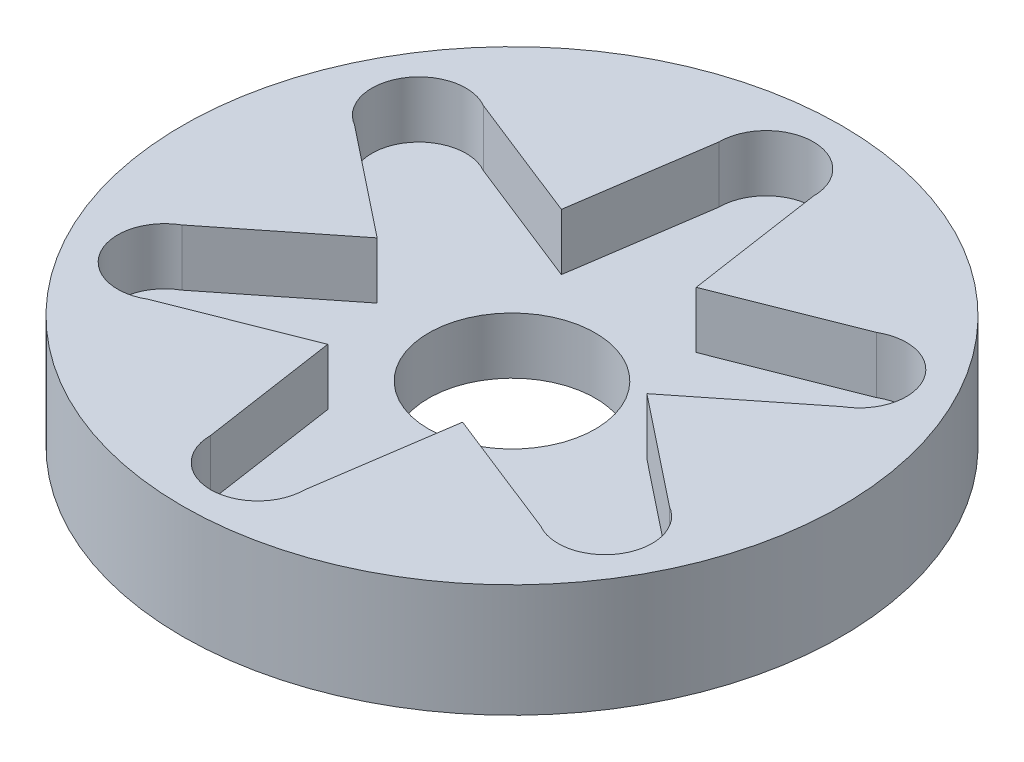
ISO-10303-21;
HEADER;
FILE_DESCRIPTION(('STEP AP214'),'2;1');
FILE_NAME('part.step','',(''),(''),'','','');
FILE_SCHEMA(('AUTOMOTIVE_DESIGN { 1 0 10303 214 1 1 1 1 }'));
ENDSEC;
DATA;
#1=APPLICATION_CONTEXT('core data for automotive mechanical design processes');
#2=APPLICATION_PROTOCOL_DEFINITION('international standard','automotive_design',2000,#1);
#3=PRODUCT_CONTEXT('',#1,'mechanical');
#4=PRODUCT('Part','Part','',(#3));
#5=PRODUCT_RELATED_PRODUCT_CATEGORY('part','',(#4));
#6=PRODUCT_DEFINITION_FORMATION('','',#4);
#7=PRODUCT_DEFINITION_CONTEXT('part definition',#1,'design');
#8=PRODUCT_DEFINITION('design','',#6,#7);
#9=PRODUCT_DEFINITION_SHAPE('','',#8);
#10=(LENGTH_UNIT() NAMED_UNIT(*) SI_UNIT(.MILLI.,.METRE.));
#11=(NAMED_UNIT(*) PLANE_ANGLE_UNIT() SI_UNIT($,.RADIAN.));
#12=(NAMED_UNIT(*) SI_UNIT($,.STERADIAN.) SOLID_ANGLE_UNIT());
#13=UNCERTAINTY_MEASURE_WITH_UNIT(LENGTH_MEASURE(1.E-05),#10,'distance_accuracy_value','');
#14=(GEOMETRIC_REPRESENTATION_CONTEXT(3) GLOBAL_UNCERTAINTY_ASSIGNED_CONTEXT((#13)) GLOBAL_UNIT_ASSIGNED_CONTEXT((#10,
#11,#12)) REPRESENTATION_CONTEXT('',''));
#15=CARTESIAN_POINT('',(0.,0.,0.));
#16=DIRECTION('',(0.,0.,1.));
#17=DIRECTION('',(1.,0.,0.));
#18=AXIS2_PLACEMENT_3D('',#15,#16,#17);
#19=CARTESIAN_POINT('',(-11.6913429510899,6.,-6.74999999999999));
#20=DIRECTION('',(0.,-1.,0.));
#21=DIRECTION('',(0.,0.,-1.));
#22=AXIS2_PLACEMENT_3D('',#19,#20,#21);
#23=CYLINDRICAL_SURFACE('',#22,2.5);
#24=CARTESIAN_POINT('',(-11.6913429510899,3.,-6.74999999999999));
#25=DIRECTION('',(0.,1.,0.));
#26=DIRECTION('',(0.,0.,1.));
#27=AXIS2_PLACEMENT_3D('',#24,#25,#26);
#28=CIRCLE('',#27,2.5);
#29=CARTESIAN_POINT('',(-10.4413429510899,3.,-8.91506350946109));
#30=VERTEX_POINT('',#29);
#31=CARTESIAN_POINT('',(-12.9413429510899,3.,-4.58493649053889));
#32=VERTEX_POINT('',#31);
#33=EDGE_CURVE('E108',#30,#32,#28,.T.);
#34=ORIENTED_EDGE('',*,*,#33,.F.);
#35=DIRECTION('',(0.,-1.,0.));
#36=VECTOR('',#35,1.);
#37=CARTESIAN_POINT('',(-10.4413429510899,6.,-8.91506350946109));
#38=LINE('',#37,#36);
#39=CARTESIAN_POINT('',(-10.4413429510899,6.,-8.91506350946109));
#40=VERTEX_POINT('',#39);
#41=EDGE_CURVE('E12',#40,#30,#38,.T.);
#42=ORIENTED_EDGE('',*,*,#41,.F.);
#43=CARTESIAN_POINT('',(-11.6913429510899,6.,-6.74999999999999));
#44=DIRECTION('',(0.,1.,0.));
#45=DIRECTION('',(0.,0.,1.));
#46=AXIS2_PLACEMENT_3D('',#43,#44,#45);
#47=CIRCLE('',#46,2.5);
#48=CARTESIAN_POINT('',(-12.9413429510899,6.,-4.58493649053889));
#49=VERTEX_POINT('',#48);
#50=EDGE_CURVE('E266',#40,#49,#47,.T.);
#51=ORIENTED_EDGE('',*,*,#50,.T.);
#52=DIRECTION('',(0.,-1.,0.));
#53=VECTOR('',#52,1.);
#54=CARTESIAN_POINT('',(-12.9413429510899,6.,-4.58493649053889));
#55=LINE('',#54,#53);
#56=EDGE_CURVE('E229',#49,#32,#55,.T.);
#57=ORIENTED_EDGE('',*,*,#56,.T.);
#58=EDGE_LOOP('',(#34,#42,#51,#57));
#59=FACE_BOUND('',#58,.T.);
#60=ADVANCED_FACE('F94',(#59),#23,.F.);
#61=CARTESIAN_POINT('',(1.63672705202787,6.,-4.13959239881188));
#62=DIRECTION('',(0.367686867782864,0.,-0.929949658454707));
#63=DIRECTION('',(-0.929949658454707,0.,-0.367686867782864));
#64=AXIS2_PLACEMENT_3D('',#61,#62,#63);
#65=PLANE('',#64);
#66=ORIENTED_EDGE('',*,*,#41,.T.);
#67=DIRECTION('',(0.929949658454707,0.,0.367686867782864));
#68=VECTOR('',#67,1.);
#69=CARTESIAN_POINT('',(1.63672705202787,3.,-4.13959239881188));
#70=LINE('',#69,#68);
#71=CARTESIAN_POINT('',(-3.58109149415789,3.,-6.20263241443421));
#72=VERTEX_POINT('',#71);
#73=EDGE_CURVE('E114',#30,#72,#70,.T.);
#74=ORIENTED_EDGE('',*,*,#73,.T.);
#75=DIRECTION('',(0.,-1.,0.));
#76=VECTOR('',#75,1.);
#77=CARTESIAN_POINT('',(-3.58109149415789,6.,-6.20263241443421));
#78=LINE('',#77,#76);
#79=CARTESIAN_POINT('',(-3.58109149415789,6.,-6.20263241443421));
#80=VERTEX_POINT('',#79);
#81=EDGE_CURVE('E101',#80,#72,#78,.T.);
#82=ORIENTED_EDGE('',*,*,#81,.F.);
#83=DIRECTION('',(0.929949658454707,0.,0.367686867782864));
#84=VECTOR('',#83,1.);
#85=CARTESIAN_POINT('',(1.63672705202787,6.,-4.13959239881188));
#86=LINE('',#85,#84);
#87=EDGE_CURVE('E269',#40,#80,#86,.T.);
#88=ORIENTED_EDGE('',*,*,#87,.F.);
#89=EDGE_LOOP('',(#66,#74,#82,#88));
#90=FACE_BOUND('',#89,.T.);
#91=ADVANCED_FACE('F429',(#90),#65,.F.);
#92=CARTESIAN_POINT('',(-4.40335570469799,6.,-0.65234899328859));
#93=DIRECTION('',(0.989203462353871,0.,0.146548661089462));
#94=DIRECTION('',(0.146548661089462,0.,-0.989203462353871));
#95=AXIS2_PLACEMENT_3D('',#92,#93,#94);
#96=PLANE('',#95);
#97=DIRECTION('',(-0.146548661089462,0.,0.989203462353871));
#98=VECTOR('',#97,1.);
#99=CARTESIAN_POINT('',(-4.40335570469799,3.,-0.65234899328859));
#100=LINE('',#99,#98);
#101=CARTESIAN_POINT('',(-2.5,3.,-13.5));
#102=VERTEX_POINT('',#101);
#103=EDGE_CURVE('E360',#102,#72,#100,.T.);
#104=ORIENTED_EDGE('',*,*,#103,.F.);
#105=DIRECTION('',(0.,-1.,0.));
#106=VECTOR('',#105,1.);
#107=CARTESIAN_POINT('',(-2.5,6.,-13.5));
#108=LINE('',#107,#106);
#109=CARTESIAN_POINT('',(-2.5,6.,-13.5));
#110=VERTEX_POINT('',#109);
#111=EDGE_CURVE('E355',#110,#102,#108,.T.);
#112=ORIENTED_EDGE('',*,*,#111,.F.);
#113=DIRECTION('',(-0.146548661089462,0.,0.989203462353871));
#114=VECTOR('',#113,1.);
#115=CARTESIAN_POINT('',(-4.40335570469799,6.,-0.65234899328859));
#116=LINE('',#115,#114);
#117=EDGE_CURVE('E271',#110,#80,#116,.T.);
#118=ORIENTED_EDGE('',*,*,#117,.T.);
#119=ORIENTED_EDGE('',*,*,#81,.T.);
#120=EDGE_LOOP('',(#104,#112,#118,#119));
#121=FACE_BOUND('',#120,.T.);
#122=ADVANCED_FACE('F359',(#121),#96,.T.);
#123=CARTESIAN_POINT('',(0.,6.,-13.5));
#124=DIRECTION('',(0.,-1.,0.));
#125=DIRECTION('',(0.,0.,-1.));
#126=AXIS2_PLACEMENT_3D('',#123,#124,#125);
#127=CYLINDRICAL_SURFACE('',#126,2.5);
#128=CARTESIAN_POINT('',(0.,3.,-13.5));
#129=DIRECTION('',(0.,1.,0.));
#130=DIRECTION('',(0.,0.,1.));
#131=AXIS2_PLACEMENT_3D('',#128,#129,#130);
#132=CIRCLE('',#131,2.5);
#133=CARTESIAN_POINT('',(2.5,3.,-13.5));
#134=VERTEX_POINT('',#133);
#135=EDGE_CURVE('E365',#134,#102,#132,.T.);
#136=ORIENTED_EDGE('',*,*,#135,.F.);
#137=DIRECTION('',(0.,-1.,0.));
#138=VECTOR('',#137,1.);
#139=CARTESIAN_POINT('',(2.5,6.,-13.5));
#140=LINE('',#139,#138);
#141=CARTESIAN_POINT('',(2.5,6.,-13.5));
#142=VERTEX_POINT('',#141);
#143=EDGE_CURVE('E352',#142,#134,#140,.T.);
#144=ORIENTED_EDGE('',*,*,#143,.F.);
#145=CARTESIAN_POINT('',(0.,6.,-13.5));
#146=DIRECTION('',(0.,1.,0.));
#147=DIRECTION('',(0.,0.,1.));
#148=AXIS2_PLACEMENT_3D('',#145,#146,#147);
#149=CIRCLE('',#148,2.5);
#150=EDGE_CURVE('E274',#142,#110,#149,.T.);
#151=ORIENTED_EDGE('',*,*,#150,.T.);
#152=ORIENTED_EDGE('',*,*,#111,.T.);
#153=EDGE_LOOP('',(#136,#144,#151,#152));
#154=FACE_BOUND('',#153,.T.);
#155=ADVANCED_FACE('F428',(#154),#127,.F.);
#156=CARTESIAN_POINT('',(4.40335570469799,6.,-0.65234899328859));
#157=DIRECTION('',(0.989203462353871,0.,-0.146548661089462));
#158=DIRECTION('',(-0.146548661089462,0.,-0.989203462353871));
#159=AXIS2_PLACEMENT_3D('',#156,#157,#158);
#160=PLANE('',#159);
#161=ORIENTED_EDGE('',*,*,#143,.T.);
#162=DIRECTION('',(0.146548661089462,0.,0.989203462353871));
#163=VECTOR('',#162,1.);
#164=CARTESIAN_POINT('',(4.40335570469799,3.,-0.65234899328859));
#165=LINE('',#164,#163);
#166=CARTESIAN_POINT('',(3.58109149415789,3.,-6.20263241443422));
#167=VERTEX_POINT('',#166);
#168=EDGE_CURVE('E367',#134,#167,#165,.T.);
#169=ORIENTED_EDGE('',*,*,#168,.T.);
#170=DIRECTION('',(0.,-1.,0.));
#171=VECTOR('',#170,1.);
#172=CARTESIAN_POINT('',(3.58109149415789,6.,-6.20263241443422));
#173=LINE('',#172,#171);
#174=CARTESIAN_POINT('',(3.58109149415789,6.,-6.20263241443422));
#175=VERTEX_POINT('',#174);
#176=EDGE_CURVE('E349',#175,#167,#173,.T.);
#177=ORIENTED_EDGE('',*,*,#176,.F.);
#178=DIRECTION('',(0.146548661089462,0.,0.989203462353871));
#179=VECTOR('',#178,1.);
#180=CARTESIAN_POINT('',(4.40335570469799,6.,-0.65234899328859));
#181=LINE('',#180,#179);
#182=EDGE_CURVE('E277',#142,#175,#181,.T.);
#183=ORIENTED_EDGE('',*,*,#182,.F.);
#184=EDGE_LOOP('',(#161,#169,#177,#183));
#185=FACE_BOUND('',#184,.T.);
#186=ADVANCED_FACE('F425',(#185),#160,.F.);
#187=CARTESIAN_POINT('',(-1.63672705202787,6.,-4.13959239881188));
#188=DIRECTION('',(0.367686867782865,0.,0.929949658454707));
#189=DIRECTION('',(0.929949658454707,0.,-0.367686867782865));
#190=AXIS2_PLACEMENT_3D('',#187,#188,#189);
#191=PLANE('',#190);
#192=DIRECTION('',(-0.929949658454707,0.,0.367686867782865));
#193=VECTOR('',#192,1.);
#194=CARTESIAN_POINT('',(-1.63672705202787,3.,-4.13959239881188));
#195=LINE('',#194,#193);
#196=CARTESIAN_POINT('',(10.4413429510899,3.,-8.9150635094611));
#197=VERTEX_POINT('',#196);
#198=EDGE_CURVE('E371',#197,#167,#195,.T.);
#199=ORIENTED_EDGE('',*,*,#198,.F.);
#200=DIRECTION('',(0.,-1.,0.));
#201=VECTOR('',#200,1.);
#202=CARTESIAN_POINT('',(10.4413429510899,6.,-8.9150635094611));
#203=LINE('',#202,#201);
#204=CARTESIAN_POINT('',(10.4413429510899,6.,-8.9150635094611));
#205=VERTEX_POINT('',#204);
#206=EDGE_CURVE('E346',#205,#197,#203,.T.);
#207=ORIENTED_EDGE('',*,*,#206,.F.);
#208=DIRECTION('',(-0.929949658454707,0.,0.367686867782865));
#209=VECTOR('',#208,1.);
#210=CARTESIAN_POINT('',(-1.63672705202787,6.,-4.13959239881188));
#211=LINE('',#210,#209);
#212=EDGE_CURVE('E279',#205,#175,#211,.T.);
#213=ORIENTED_EDGE('',*,*,#212,.T.);
#214=ORIENTED_EDGE('',*,*,#176,.T.);
#215=EDGE_LOOP('',(#199,#207,#213,#214));
#216=FACE_BOUND('',#215,.T.);
#217=ADVANCED_FACE('F420',(#216),#191,.T.);
#218=CARTESIAN_POINT('',(11.6913429510899,6.,-6.75));
#219=DIRECTION('',(0.,-1.,0.));
#220=DIRECTION('',(0.,0.,-1.));
#221=AXIS2_PLACEMENT_3D('',#218,#219,#220);
#222=CYLINDRICAL_SURFACE('',#221,2.5);
#223=CARTESIAN_POINT('',(11.6913429510899,3.,-6.75));
#224=DIRECTION('',(0.,1.,0.));
#225=DIRECTION('',(0.,0.,1.));
#226=AXIS2_PLACEMENT_3D('',#223,#224,#225);
#227=CIRCLE('',#226,2.5);
#228=CARTESIAN_POINT('',(12.9413429510899,3.,-4.58493649053891));
#229=VERTEX_POINT('',#228);
#230=EDGE_CURVE('E374',#229,#197,#227,.T.);
#231=ORIENTED_EDGE('',*,*,#230,.F.);
#232=DIRECTION('',(0.,-1.,0.));
#233=VECTOR('',#232,1.);
#234=CARTESIAN_POINT('',(12.9413429510899,6.,-4.58493649053891));
#235=LINE('',#234,#233);
#236=CARTESIAN_POINT('',(12.9413429510899,6.,-4.58493649053891));
#237=VERTEX_POINT('',#236);
#238=EDGE_CURVE('E343',#237,#229,#235,.T.);
#239=ORIENTED_EDGE('',*,*,#238,.F.);
#240=CARTESIAN_POINT('',(11.6913429510899,6.,-6.75));
#241=DIRECTION('',(0.,1.,0.));
#242=DIRECTION('',(0.,0.,1.));
#243=AXIS2_PLACEMENT_3D('',#240,#241,#242);
#244=CIRCLE('',#243,2.5);
#245=EDGE_CURVE('E282',#237,#205,#244,.T.);
#246=ORIENTED_EDGE('',*,*,#245,.T.);
#247=ORIENTED_EDGE('',*,*,#206,.T.);
#248=EDGE_LOOP('',(#231,#239,#246,#247));
#249=FACE_BOUND('',#248,.T.);
#250=ADVANCED_FACE('F418',(#249),#222,.F.);
#251=CARTESIAN_POINT('',(2.76662865267012,6.,3.48724340552329));
#252=DIRECTION('',(0.621516594571006,0.,0.783400997365245));
#253=DIRECTION('',(0.783400997365244,0.,-0.621516594571006));
#254=AXIS2_PLACEMENT_3D('',#251,#252,#253);
#255=PLANE('',#254);
#256=ORIENTED_EDGE('',*,*,#238,.T.);
#257=DIRECTION('',(-0.783400997365245,0.,0.621516594571006));
#258=VECTOR('',#257,1.);
#259=CARTESIAN_POINT('',(2.76662865267012,3.,3.48724340552329));
#260=LINE('',#259,#258);
#261=CARTESIAN_POINT('',(7.16218298831579,3.,0.));
#262=VERTEX_POINT('',#261);
#263=EDGE_CURVE('E377',#229,#262,#260,.T.);
#264=ORIENTED_EDGE('',*,*,#263,.T.);
#265=DIRECTION('',(0.,-1.,0.));
#266=VECTOR('',#265,1.);
#267=CARTESIAN_POINT('',(7.16218298831579,6.,0.));
#268=LINE('',#267,#266);
#269=CARTESIAN_POINT('',(7.16218298831579,6.,0.));
#270=VERTEX_POINT('',#269);
#271=EDGE_CURVE('E340',#270,#262,#268,.T.);
#272=ORIENTED_EDGE('',*,*,#271,.F.);
#273=DIRECTION('',(-0.783400997365245,0.,0.621516594571006));
#274=VECTOR('',#273,1.);
#275=CARTESIAN_POINT('',(2.76662865267012,6.,3.48724340552329));
#276=LINE('',#275,#274);
#277=EDGE_CURVE('E285',#237,#270,#276,.T.);
#278=ORIENTED_EDGE('',*,*,#277,.F.);
#279=EDGE_LOOP('',(#256,#264,#272,#278));
#280=FACE_BOUND('',#279,.T.);
#281=ADVANCED_FACE('F415',(#280),#255,.F.);
#282=CARTESIAN_POINT('',(2.76662865267012,6.,-3.48724340552329));
#283=DIRECTION('',(-0.621516594571006,0.,0.783400997365244));
#284=DIRECTION('',(0.783400997365245,0.,0.621516594571006));
#285=AXIS2_PLACEMENT_3D('',#282,#283,#284);
#286=PLANE('',#285);
#287=DIRECTION('',(-0.783400997365245,0.,-0.621516594571006));
#288=VECTOR('',#287,1.);
#289=CARTESIAN_POINT('',(2.76662865267012,3.,-3.48724340552329));
#290=LINE('',#289,#288);
#291=CARTESIAN_POINT('',(12.9413429510899,3.,4.5849364905389));
#292=VERTEX_POINT('',#291);
#293=EDGE_CURVE('E379',#292,#262,#290,.T.);
#294=ORIENTED_EDGE('',*,*,#293,.F.);
#295=DIRECTION('',(0.,-1.,0.));
#296=VECTOR('',#295,1.);
#297=CARTESIAN_POINT('',(12.9413429510899,6.,4.5849364905389));
#298=LINE('',#297,#296);
#299=CARTESIAN_POINT('',(12.9413429510899,6.,4.5849364905389));
#300=VERTEX_POINT('',#299);
#301=EDGE_CURVE('E337',#300,#292,#298,.T.);
#302=ORIENTED_EDGE('',*,*,#301,.F.);
#303=DIRECTION('',(-0.783400997365245,0.,-0.621516594571006));
#304=VECTOR('',#303,1.);
#305=CARTESIAN_POINT('',(2.76662865267012,6.,-3.48724340552329));
#306=LINE('',#305,#304);
#307=EDGE_CURVE('E287',#300,#270,#306,.T.);
#308=ORIENTED_EDGE('',*,*,#307,.T.);
#309=ORIENTED_EDGE('',*,*,#271,.T.);
#310=EDGE_LOOP('',(#294,#302,#308,#309));
#311=FACE_BOUND('',#310,.T.);
#312=ADVANCED_FACE('F411',(#311),#286,.T.);
#313=CARTESIAN_POINT('',(11.6913429510899,6.,6.75));
#314=DIRECTION('',(0.,-1.,0.));
#315=DIRECTION('',(0.,0.,-1.));
#316=AXIS2_PLACEMENT_3D('',#313,#314,#315);
#317=CYLINDRICAL_SURFACE('',#316,2.5);
#318=CARTESIAN_POINT('',(11.6913429510899,3.,6.75));
#319=DIRECTION('',(0.,1.,0.));
#320=DIRECTION('',(0.,0.,1.));
#321=AXIS2_PLACEMENT_3D('',#318,#319,#320);
#322=CIRCLE('',#321,2.5);
#323=CARTESIAN_POINT('',(10.4413429510899,3.,8.9150635094611));
#324=VERTEX_POINT('',#323);
#325=EDGE_CURVE('E382',#324,#292,#322,.T.);
#326=ORIENTED_EDGE('',*,*,#325,.F.);
#327=DIRECTION('',(0.,-1.,0.));
#328=VECTOR('',#327,1.);
#329=CARTESIAN_POINT('',(10.4413429510899,6.,8.9150635094611));
#330=LINE('',#329,#328);
#331=CARTESIAN_POINT('',(10.4413429510899,6.,8.9150635094611));
#332=VERTEX_POINT('',#331);
#333=EDGE_CURVE('E334',#332,#324,#330,.T.);
#334=ORIENTED_EDGE('',*,*,#333,.F.);
#335=CARTESIAN_POINT('',(11.6913429510899,6.,6.75));
#336=DIRECTION('',(0.,1.,0.));
#337=DIRECTION('',(0.,0.,1.));
#338=AXIS2_PLACEMENT_3D('',#335,#336,#337);
#339=CIRCLE('',#338,2.5);
#340=EDGE_CURVE('E290',#332,#300,#339,.T.);
#341=ORIENTED_EDGE('',*,*,#340,.T.);
#342=ORIENTED_EDGE('',*,*,#301,.T.);
#343=EDGE_LOOP('',(#326,#334,#341,#342));
#344=FACE_BOUND('',#343,.T.);
#345=ADVANCED_FACE('F408',(#344),#317,.F.);
#346=CARTESIAN_POINT('',(-1.63672705202787,6.,4.13959239881188));
#347=DIRECTION('',(-0.367686867782865,0.,0.929949658454707));
#348=DIRECTION('',(0.929949658454707,0.,0.367686867782865));
#349=AXIS2_PLACEMENT_3D('',#346,#347,#348);
#350=PLANE('',#349);
#351=ORIENTED_EDGE('',*,*,#333,.T.);
#352=DIRECTION('',(-0.929949658454707,0.,-0.367686867782865));
#353=VECTOR('',#352,1.);
#354=CARTESIAN_POINT('',(-1.63672705202787,3.,4.13959239881188));
#355=LINE('',#354,#353);
#356=CARTESIAN_POINT('',(3.58109149415789,3.,6.20263241443421));
#357=VERTEX_POINT('',#356);
#358=EDGE_CURVE('E265',#324,#357,#355,.T.);
#359=ORIENTED_EDGE('',*,*,#358,.T.);
#360=DIRECTION('',(0.,-1.,0.));
#361=VECTOR('',#360,1.);
#362=CARTESIAN_POINT('',(3.58109149415789,6.,6.20263241443421));
#363=LINE('',#362,#361);
#364=CARTESIAN_POINT('',(3.58109149415789,6.,6.20263241443421));
#365=VERTEX_POINT('',#364);
#366=EDGE_CURVE('E331',#365,#357,#363,.T.);
#367=ORIENTED_EDGE('',*,*,#366,.F.);
#368=DIRECTION('',(-0.929949658454707,0.,-0.367686867782865));
#369=VECTOR('',#368,1.);
#370=CARTESIAN_POINT('',(-1.63672705202787,6.,4.13959239881188));
#371=LINE('',#370,#369);
#372=EDGE_CURVE('E293',#332,#365,#371,.T.);
#373=ORIENTED_EDGE('',*,*,#372,.F.);
#374=EDGE_LOOP('',(#351,#359,#367,#373));
#375=FACE_BOUND('',#374,.T.);
#376=ADVANCED_FACE('F387',(#375),#350,.F.);
#377=CARTESIAN_POINT('',(4.40335570469799,6.,0.65234899328859));
#378=DIRECTION('',(-0.989203462353871,0.,-0.146548661089462));
#379=DIRECTION('',(-0.146548661089462,0.,0.989203462353871));
#380=AXIS2_PLACEMENT_3D('',#377,#378,#379);
#381=PLANE('',#380);
#382=DIRECTION('',(0.146548661089462,0.,-0.989203462353871));
#383=VECTOR('',#382,1.);
#384=CARTESIAN_POINT('',(4.40335570469799,3.,0.65234899328859));
#385=LINE('',#384,#383);
#386=CARTESIAN_POINT('',(2.5,3.,13.5));
#387=VERTEX_POINT('',#386);
#388=EDGE_CURVE('E255',#387,#357,#385,.T.);
#389=ORIENTED_EDGE('',*,*,#388,.F.);
#390=DIRECTION('',(0.,-1.,0.));
#391=VECTOR('',#390,1.);
#392=CARTESIAN_POINT('',(2.5,6.,13.5));
#393=LINE('',#392,#391);
#394=CARTESIAN_POINT('',(2.5,6.,13.5));
#395=VERTEX_POINT('',#394);
#396=EDGE_CURVE('E328',#395,#387,#393,.T.);
#397=ORIENTED_EDGE('',*,*,#396,.F.);
#398=DIRECTION('',(0.146548661089462,0.,-0.989203462353871));
#399=VECTOR('',#398,1.);
#400=CARTESIAN_POINT('',(4.40335570469799,6.,0.65234899328859));
#401=LINE('',#400,#399);
#402=EDGE_CURVE('E295',#395,#365,#401,.T.);
#403=ORIENTED_EDGE('',*,*,#402,.T.);
#404=ORIENTED_EDGE('',*,*,#366,.T.);
#405=EDGE_LOOP('',(#389,#397,#403,#404));
#406=FACE_BOUND('',#405,.T.);
#407=ADVANCED_FACE('F390',(#406),#381,.T.);
#408=CARTESIAN_POINT('',(0.,6.,13.5));
#409=DIRECTION('',(0.,-1.,0.));
#410=DIRECTION('',(0.,0.,-1.));
#411=AXIS2_PLACEMENT_3D('',#408,#409,#410);
#412=CYLINDRICAL_SURFACE('',#411,2.5);
#413=CARTESIAN_POINT('',(0.,3.,13.5));
#414=DIRECTION('',(0.,1.,0.));
#415=DIRECTION('',(0.,0.,1.));
#416=AXIS2_PLACEMENT_3D('',#413,#414,#415);
#417=CIRCLE('',#416,2.5);
#418=CARTESIAN_POINT('',(-2.5,3.,13.5));
#419=VERTEX_POINT('',#418);
#420=EDGE_CURVE('E252',#419,#387,#417,.T.);
#421=ORIENTED_EDGE('',*,*,#420,.F.);
#422=DIRECTION('',(0.,-1.,0.));
#423=VECTOR('',#422,1.);
#424=CARTESIAN_POINT('',(-2.5,6.,13.5));
#425=LINE('',#424,#423);
#426=CARTESIAN_POINT('',(-2.5,6.,13.5));
#427=VERTEX_POINT('',#426);
#428=EDGE_CURVE('E325',#427,#419,#425,.T.);
#429=ORIENTED_EDGE('',*,*,#428,.F.);
#430=CARTESIAN_POINT('',(0.,6.,13.5));
#431=DIRECTION('',(0.,1.,0.));
#432=DIRECTION('',(0.,0.,1.));
#433=AXIS2_PLACEMENT_3D('',#430,#431,#432);
#434=CIRCLE('',#433,2.5);
#435=EDGE_CURVE('E298',#427,#395,#434,.T.);
#436=ORIENTED_EDGE('',*,*,#435,.T.);
#437=ORIENTED_EDGE('',*,*,#396,.T.);
#438=EDGE_LOOP('',(#421,#429,#436,#437));
#439=FACE_BOUND('',#438,.T.);
#440=ADVANCED_FACE('F394',(#439),#412,.F.);
#441=CARTESIAN_POINT('',(-4.40335570469799,6.,0.652348993288591));
#442=DIRECTION('',(-0.989203462353871,0.,0.146548661089462));
#443=DIRECTION('',(0.146548661089462,0.,0.989203462353871));
#444=AXIS2_PLACEMENT_3D('',#441,#442,#443);
#445=PLANE('',#444);
#446=ORIENTED_EDGE('',*,*,#428,.T.);
#447=DIRECTION('',(-0.146548661089462,0.,-0.989203462353871));
#448=VECTOR('',#447,1.);
#449=CARTESIAN_POINT('',(-4.40335570469799,3.,0.652348993288591));
#450=LINE('',#449,#448);
#451=CARTESIAN_POINT('',(-3.58109149415789,3.,6.20263241443422));
#452=VERTEX_POINT('',#451);
#453=EDGE_CURVE('E250',#419,#452,#450,.T.);
#454=ORIENTED_EDGE('',*,*,#453,.T.);
#455=DIRECTION('',(0.,-1.,0.));
#456=VECTOR('',#455,1.);
#457=CARTESIAN_POINT('',(-3.58109149415789,6.,6.20263241443422));
#458=LINE('',#457,#456);
#459=CARTESIAN_POINT('',(-3.58109149415789,6.,6.20263241443422));
#460=VERTEX_POINT('',#459);
#461=EDGE_CURVE('E322',#460,#452,#458,.T.);
#462=ORIENTED_EDGE('',*,*,#461,.F.);
#463=DIRECTION('',(-0.146548661089462,0.,-0.989203462353871));
#464=VECTOR('',#463,1.);
#465=CARTESIAN_POINT('',(-4.40335570469799,6.,0.652348993288591));
#466=LINE('',#465,#464);
#467=EDGE_CURVE('E301',#427,#460,#466,.T.);
#468=ORIENTED_EDGE('',*,*,#467,.F.);
#469=EDGE_LOOP('',(#446,#454,#462,#468));
#470=FACE_BOUND('',#469,.T.);
#471=ADVANCED_FACE('F397',(#470),#445,.F.);
#472=CARTESIAN_POINT('',(1.63672705202787,6.,4.13959239881188));
#473=DIRECTION('',(-0.367686867782865,0.,-0.929949658454707));
#474=DIRECTION('',(-0.929949658454707,0.,0.367686867782865));
#475=AXIS2_PLACEMENT_3D('',#472,#473,#474);
#476=PLANE('',#475);
#477=DIRECTION('',(0.929949658454707,0.,-0.367686867782865));
#478=VECTOR('',#477,1.);
#479=CARTESIAN_POINT('',(1.63672705202787,3.,4.13959239881188));
#480=LINE('',#479,#478);
#481=CARTESIAN_POINT('',(-10.4413429510899,3.,8.9150635094611));
#482=VERTEX_POINT('',#481);
#483=EDGE_CURVE('E247',#482,#452,#480,.T.);
#484=ORIENTED_EDGE('',*,*,#483,.F.);
#485=DIRECTION('',(0.,-1.,0.));
#486=VECTOR('',#485,1.);
#487=CARTESIAN_POINT('',(-10.4413429510899,6.,8.9150635094611));
#488=LINE('',#487,#486);
#489=CARTESIAN_POINT('',(-10.4413429510899,6.,8.9150635094611));
#490=VERTEX_POINT('',#489);
#491=EDGE_CURVE('E319',#490,#482,#488,.T.);
#492=ORIENTED_EDGE('',*,*,#491,.F.);
#493=DIRECTION('',(0.929949658454707,0.,-0.367686867782865));
#494=VECTOR('',#493,1.);
#495=CARTESIAN_POINT('',(1.63672705202787,6.,4.13959239881188));
#496=LINE('',#495,#494);
#497=EDGE_CURVE('E303',#490,#460,#496,.T.);
#498=ORIENTED_EDGE('',*,*,#497,.T.);
#499=ORIENTED_EDGE('',*,*,#461,.T.);
#500=EDGE_LOOP('',(#484,#492,#498,#499));
#501=FACE_BOUND('',#500,.T.);
#502=ADVANCED_FACE('F434',(#501),#476,.T.);
#503=CARTESIAN_POINT('',(-11.6913429510899,6.,6.75000000000001));
#504=DIRECTION('',(0.,-1.,0.));
#505=DIRECTION('',(0.,0.,-1.));
#506=AXIS2_PLACEMENT_3D('',#503,#504,#505);
#507=CYLINDRICAL_SURFACE('',#506,2.5);
#508=CARTESIAN_POINT('',(-11.6913429510899,3.,6.75000000000001));
#509=DIRECTION('',(0.,1.,0.));
#510=DIRECTION('',(0.,0.,1.));
#511=AXIS2_PLACEMENT_3D('',#508,#509,#510);
#512=CIRCLE('',#511,2.5);
#513=CARTESIAN_POINT('',(-12.9413429510899,3.,4.58493649053891));
#514=VERTEX_POINT('',#513);
#515=EDGE_CURVE('E237',#514,#482,#512,.T.);
#516=ORIENTED_EDGE('',*,*,#515,.F.);
#517=DIRECTION('',(0.,-1.,0.));
#518=VECTOR('',#517,1.);
#519=CARTESIAN_POINT('',(-12.9413429510899,6.,4.58493649053891));
#520=LINE('',#519,#518);
#521=CARTESIAN_POINT('',(-12.9413429510899,6.,4.58493649053891));
#522=VERTEX_POINT('',#521);
#523=EDGE_CURVE('E228',#522,#514,#520,.T.);
#524=ORIENTED_EDGE('',*,*,#523,.F.);
#525=CARTESIAN_POINT('',(-11.6913429510899,6.,6.75000000000001));
#526=DIRECTION('',(0.,1.,0.));
#527=DIRECTION('',(0.,0.,1.));
#528=AXIS2_PLACEMENT_3D('',#525,#526,#527);
#529=CIRCLE('',#528,2.5);
#530=EDGE_CURVE('E306',#522,#490,#529,.T.);
#531=ORIENTED_EDGE('',*,*,#530,.T.);
#532=ORIENTED_EDGE('',*,*,#491,.T.);
#533=EDGE_LOOP('',(#516,#524,#531,#532));
#534=FACE_BOUND('',#533,.T.);
#535=ADVANCED_FACE('F432',(#534),#507,.F.);
#536=CARTESIAN_POINT('',(-2.76662865267012,6.,-3.48724340552329));
#537=DIRECTION('',(-0.621516594571006,0.,-0.783400997365244));
#538=DIRECTION('',(-0.783400997365245,0.,0.621516594571006));
#539=AXIS2_PLACEMENT_3D('',#536,#537,#538);
#540=PLANE('',#539);
#541=ORIENTED_EDGE('',*,*,#523,.T.);
#542=DIRECTION('',(0.783400997365244,0.,-0.621516594571006));
#543=VECTOR('',#542,1.);
#544=CARTESIAN_POINT('',(-2.76662865267012,3.,-3.48724340552329));
#545=LINE('',#544,#543);
#546=CARTESIAN_POINT('',(-7.16218298831579,3.,0.));
#547=VERTEX_POINT('',#546);
#548=EDGE_CURVE('E233',#514,#547,#545,.T.);
#549=ORIENTED_EDGE('',*,*,#548,.T.);
#550=DIRECTION('',(0.,-1.,0.));
#551=VECTOR('',#550,1.);
#552=CARTESIAN_POINT('',(-7.16218298831579,6.,0.));
#553=LINE('',#552,#551);
#554=CARTESIAN_POINT('',(-7.16218298831579,6.,0.));
#555=VERTEX_POINT('',#554);
#556=EDGE_CURVE('E219',#555,#547,#553,.T.);
#557=ORIENTED_EDGE('',*,*,#556,.F.);
#558=DIRECTION('',(0.783400997365244,0.,-0.621516594571006));
#559=VECTOR('',#558,1.);
#560=CARTESIAN_POINT('',(-2.76662865267012,6.,-3.48724340552329));
#561=LINE('',#560,#559);
#562=EDGE_CURVE('E309',#522,#555,#561,.T.);
#563=ORIENTED_EDGE('',*,*,#562,.F.);
#564=EDGE_LOOP('',(#541,#549,#557,#563));
#565=FACE_BOUND('',#564,.T.);
#566=ADVANCED_FACE('F234',(#565),#540,.F.);
#567=CARTESIAN_POINT('',(-2.76662865267012,6.,3.48724340552329));
#568=DIRECTION('',(0.621516594571005,0.,-0.783400997365245));
#569=DIRECTION('',(-0.783400997365245,0.,-0.621516594571005));
#570=AXIS2_PLACEMENT_3D('',#567,#568,#569);
#571=PLANE('',#570);
#572=DIRECTION('',(0.783400997365245,0.,0.621516594571005));
#573=VECTOR('',#572,1.);
#574=CARTESIAN_POINT('',(-2.76662865267012,3.,3.48724340552329));
#575=LINE('',#574,#573);
#576=EDGE_CURVE('E223',#32,#547,#575,.T.);
#577=ORIENTED_EDGE('',*,*,#576,.F.);
#578=ORIENTED_EDGE('',*,*,#56,.F.);
#579=DIRECTION('',(0.783400997365245,0.,0.621516594571005));
#580=VECTOR('',#579,1.);
#581=CARTESIAN_POINT('',(-2.76662865267012,6.,3.48724340552329));
#582=LINE('',#581,#580);
#583=EDGE_CURVE('E225',#49,#555,#582,.T.);
#584=ORIENTED_EDGE('',*,*,#583,.T.);
#585=ORIENTED_EDGE('',*,*,#556,.T.);
#586=EDGE_LOOP('',(#577,#578,#584,#585));
#587=FACE_BOUND('',#586,.T.);
#588=ADVANCED_FACE('F221',(#587),#571,.T.);
#589=CARTESIAN_POINT('',(0.,6.,0.));
#590=DIRECTION('',(0.,-1.,0.));
#591=DIRECTION('',(0.,0.,-1.));
#592=AXIS2_PLACEMENT_3D('',#589,#590,#591);
#593=CYLINDRICAL_SURFACE('',#592,17.5);
#594=CARTESIAN_POINT('',(0.,6.,0.));
#595=DIRECTION('',(0.,1.,0.));
#596=DIRECTION('',(0.,0.,1.));
#597=AXIS2_PLACEMENT_3D('',#594,#595,#596);
#598=CIRCLE('',#597,17.5);
#599=CARTESIAN_POINT('',(0.,6.,17.5));
#600=VERTEX_POINT('',#599);
#601=EDGE_CURVE('E312',#600,#600,#598,.T.);
#602=ORIENTED_EDGE('',*,*,#601,.F.);
#603=EDGE_LOOP('',(#602));
#604=FACE_BOUND('',#603,.T.);
#605=CARTESIAN_POINT('',(0.,0.,0.));
#606=DIRECTION('',(0.,1.,0.));
#607=DIRECTION('',(0.,0.,1.));
#608=AXIS2_PLACEMENT_3D('',#605,#606,#607);
#609=CIRCLE('',#608,17.5);
#610=CARTESIAN_POINT('',(0.,0.,17.5));
#611=VERTEX_POINT('',#610);
#612=EDGE_CURVE('E261',#611,#611,#609,.T.);
#613=ORIENTED_EDGE('',*,*,#612,.T.);
#614=EDGE_LOOP('',(#613));
#615=FACE_BOUND('',#614,.T.);
#616=ADVANCED_FACE('F506',(#604,#615),#593,.T.);
#617=CARTESIAN_POINT('',(0.,6.,0.));
#618=DIRECTION('',(0.,1.,0.));
#619=DIRECTION('',(0.,0.,1.));
#620=AXIS2_PLACEMENT_3D('',#617,#618,#619);
#621=PLANE('',#620);
#622=ORIENTED_EDGE('',*,*,#50,.F.);
#623=ORIENTED_EDGE('',*,*,#87,.T.);
#624=ORIENTED_EDGE('',*,*,#117,.F.);
#625=ORIENTED_EDGE('',*,*,#150,.F.);
#626=ORIENTED_EDGE('',*,*,#182,.T.);
#627=ORIENTED_EDGE('',*,*,#212,.F.);
#628=ORIENTED_EDGE('',*,*,#245,.F.);
#629=ORIENTED_EDGE('',*,*,#277,.T.);
#630=ORIENTED_EDGE('',*,*,#307,.F.);
#631=ORIENTED_EDGE('',*,*,#340,.F.);
#632=ORIENTED_EDGE('',*,*,#372,.T.);
#633=ORIENTED_EDGE('',*,*,#402,.F.);
#634=ORIENTED_EDGE('',*,*,#435,.F.);
#635=ORIENTED_EDGE('',*,*,#467,.T.);
#636=ORIENTED_EDGE('',*,*,#497,.F.);
#637=ORIENTED_EDGE('',*,*,#530,.F.);
#638=ORIENTED_EDGE('',*,*,#562,.T.);
#639=ORIENTED_EDGE('',*,*,#583,.F.);
#640=EDGE_LOOP('',(#622,#623,#624,#625,#626,#627,#628,#629,#630,#631,#632,#633,#634,#635,#636,
#637,#638,#639));
#641=FACE_BOUND('',#640,.T.);
#642=ORIENTED_EDGE('',*,*,#601,.T.);
#643=EDGE_LOOP('',(#642));
#644=FACE_BOUND('',#643,.T.);
#645=ADVANCED_FACE('F403',(#641,#644),#621,.T.);
#646=CARTESIAN_POINT('',(0.,0.,0.));
#647=DIRECTION('',(0.,1.,0.));
#648=DIRECTION('',(0.,0.,1.));
#649=AXIS2_PLACEMENT_3D('',#646,#647,#648);
#650=PLANE('',#649);
#651=ORIENTED_EDGE('',*,*,#612,.F.);
#652=EDGE_LOOP('',(#651));
#653=FACE_BOUND('',#652,.T.);
#654=CARTESIAN_POINT('',(0.,0.,0.));
#655=DIRECTION('',(0.,1.,0.));
#656=DIRECTION('',(0.,0.,1.));
#657=AXIS2_PLACEMENT_3D('',#654,#655,#656);
#658=CIRCLE('',#657,4.425);
#659=CARTESIAN_POINT('',(0.,0.,4.425));
#660=VERTEX_POINT('',#659);
#661=EDGE_CURVE('E262',#660,#660,#658,.T.);
#662=ORIENTED_EDGE('',*,*,#661,.T.);
#663=EDGE_LOOP('',(#662));
#664=FACE_BOUND('',#663,.T.);
#665=ADVANCED_FACE('F513',(#653,#664),#650,.F.);
#666=CARTESIAN_POINT('',(0.,3.,0.));
#667=DIRECTION('',(0.,1.,0.));
#668=DIRECTION('',(0.,0.,1.));
#669=AXIS2_PLACEMENT_3D('',#666,#667,#668);
#670=PLANE('',#669);
#671=ORIENTED_EDGE('',*,*,#325,.T.);
#672=ORIENTED_EDGE('',*,*,#293,.T.);
#673=ORIENTED_EDGE('',*,*,#263,.F.);
#674=ORIENTED_EDGE('',*,*,#230,.T.);
#675=ORIENTED_EDGE('',*,*,#198,.T.);
#676=ORIENTED_EDGE('',*,*,#168,.F.);
#677=ORIENTED_EDGE('',*,*,#135,.T.);
#678=ORIENTED_EDGE('',*,*,#103,.T.);
#679=ORIENTED_EDGE('',*,*,#73,.F.);
#680=ORIENTED_EDGE('',*,*,#33,.T.);
#681=ORIENTED_EDGE('',*,*,#576,.T.);
#682=ORIENTED_EDGE('',*,*,#548,.F.);
#683=ORIENTED_EDGE('',*,*,#515,.T.);
#684=ORIENTED_EDGE('',*,*,#483,.T.);
#685=ORIENTED_EDGE('',*,*,#453,.F.);
#686=ORIENTED_EDGE('',*,*,#420,.T.);
#687=ORIENTED_EDGE('',*,*,#388,.T.);
#688=ORIENTED_EDGE('',*,*,#358,.F.);
#689=EDGE_LOOP('',(#671,#672,#673,#674,#675,#676,#677,#678,#679,#680,#681,#682,#683,#684,#685,
#686,#687,#688));
#690=FACE_BOUND('',#689,.T.);
#691=CARTESIAN_POINT('',(0.,3.,0.));
#692=DIRECTION('',(0.,1.,0.));
#693=DIRECTION('',(0.,0.,1.));
#694=AXIS2_PLACEMENT_3D('',#691,#692,#693);
#695=CIRCLE('',#694,4.425);
#696=CARTESIAN_POINT('',(0.,3.,4.425));
#697=VERTEX_POINT('',#696);
#698=EDGE_CURVE('E258',#697,#697,#695,.T.);
#699=ORIENTED_EDGE('',*,*,#698,.F.);
#700=EDGE_LOOP('',(#699));
#701=FACE_BOUND('',#700,.T.);
#702=ADVANCED_FACE('F240',(#690,#701),#670,.T.);
#703=CARTESIAN_POINT('',(0.,3.,0.));
#704=DIRECTION('',(0.,-1.,0.));
#705=DIRECTION('',(0.,0.,-1.));
#706=AXIS2_PLACEMENT_3D('',#703,#704,#705);
#707=CYLINDRICAL_SURFACE('',#706,4.425);
#708=ORIENTED_EDGE('',*,*,#698,.T.);
#709=EDGE_LOOP('',(#708));
#710=FACE_BOUND('',#709,.T.);
#711=ORIENTED_EDGE('',*,*,#661,.F.);
#712=EDGE_LOOP('',(#711));
#713=FACE_BOUND('',#712,.T.);
#714=ADVANCED_FACE('F520',(#710,#713),#707,.F.);
#715=CLOSED_SHELL('',(#60,#91,#122,#155,#186,#217,#250,#281,#312,#345,#376,#407,#440,#471,#502,
#535,#566,#588,#616,#645,#665,#702,#714));
#716=MANIFOLD_SOLID_BREP('B2',#715);
#717=ADVANCED_BREP_SHAPE_REPRESENTATION('',(#18,#716),#14);
#718=SHAPE_DEFINITION_REPRESENTATION(#9,#717);
ENDSEC;
END-ISO-10303-21;
